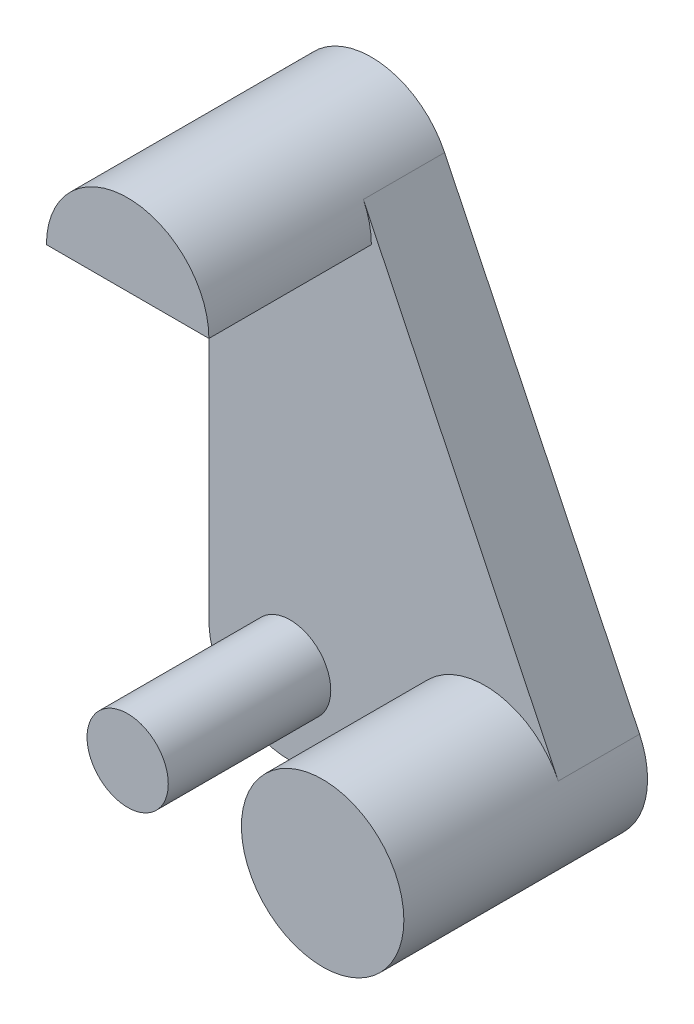
ISO-10303-21;
HEADER;
FILE_DESCRIPTION(('STEP AP214'),'2;1');
FILE_NAME('part.step','',(''),(''),'','','');
FILE_SCHEMA(('AUTOMOTIVE_DESIGN { 1 0 10303 214 1 1 1 1 }'));
ENDSEC;
DATA;
#1=APPLICATION_CONTEXT('core data for automotive mechanical design processes');
#2=APPLICATION_PROTOCOL_DEFINITION('international standard','automotive_design',2000,#1);
#3=PRODUCT_CONTEXT('',#1,'mechanical');
#4=PRODUCT('Part','Part','',(#3));
#5=PRODUCT_RELATED_PRODUCT_CATEGORY('part','',(#4));
#6=PRODUCT_DEFINITION_FORMATION('','',#4);
#7=PRODUCT_DEFINITION_CONTEXT('part definition',#1,'design');
#8=PRODUCT_DEFINITION('design','',#6,#7);
#9=PRODUCT_DEFINITION_SHAPE('','',#8);
#10=(LENGTH_UNIT() NAMED_UNIT(*) SI_UNIT(.MILLI.,.METRE.));
#11=(NAMED_UNIT(*) PLANE_ANGLE_UNIT() SI_UNIT($,.RADIAN.));
#12=(NAMED_UNIT(*) SI_UNIT($,.STERADIAN.) SOLID_ANGLE_UNIT());
#13=UNCERTAINTY_MEASURE_WITH_UNIT(LENGTH_MEASURE(1.E-05),#10,'distance_accuracy_value','');
#14=(GEOMETRIC_REPRESENTATION_CONTEXT(3) GLOBAL_UNCERTAINTY_ASSIGNED_CONTEXT((#13)) GLOBAL_UNIT_ASSIGNED_CONTEXT((#10,
#11,#12)) REPRESENTATION_CONTEXT('',''));
#15=CARTESIAN_POINT('',(0.,0.,0.));
#16=DIRECTION('',(0.,0.,1.));
#17=DIRECTION('',(1.,0.,0.));
#18=AXIS2_PLACEMENT_3D('',#15,#16,#17);
#19=CARTESIAN_POINT('',(0.,0.,5.));
#20=DIRECTION('',(0.,0.,1.));
#21=DIRECTION('',(1.,0.,0.));
#22=AXIS2_PLACEMENT_3D('',#19,#20,#21);
#23=PLANE('',#22);
#24=CARTESIAN_POINT('',(0.,0.,5.));
#25=DIRECTION('',(0.,0.,1.));
#26=DIRECTION('',(1.,0.,0.));
#27=AXIS2_PLACEMENT_3D('',#24,#25,#26);
#28=CIRCLE('',#27,2.5);
#29=CARTESIAN_POINT('',(2.5,0.,5.));
#30=VERTEX_POINT('',#29);
#31=EDGE_CURVE('E163',#30,#30,#28,.T.);
#32=ORIENTED_EDGE('',*,*,#31,.F.);
#33=EDGE_LOOP('',(#32));
#34=FACE_BOUND('',#33,.T.);
#35=DIRECTION('',(0.432731067584771,-0.901523057468274,0.));
#36=VECTOR('',#35,1.);
#37=CARTESIAN_POINT('',(14.2605411651047,6.84505975925025,5.));
#38=LINE('',#37,#36);
#39=CARTESIAN_POINT('',(4.50761528734137,27.1636553379239,5.));
#40=VERTEX_POINT('',#39);
#41=CARTESIAN_POINT('',(16.5076152873414,2.16365533792386,5.));
#42=VERTEX_POINT('',#41);
#43=EDGE_CURVE('E177',#40,#42,#38,.T.);
#44=ORIENTED_EDGE('',*,*,#43,.F.);
#45=CARTESIAN_POINT('',(0.,25.,5.));
#46=DIRECTION('',(0.,0.,1.));
#47=DIRECTION('',(1.,0.,0.));
#48=AXIS2_PLACEMENT_3D('',#45,#46,#47);
#49=CIRCLE('',#48,5.);
#50=CARTESIAN_POINT('',(5.,25.,5.));
#51=VERTEX_POINT('',#50);
#52=EDGE_CURVE('E57',#51,#40,#49,.T.);
#53=ORIENTED_EDGE('',*,*,#52,.F.);
#54=DIRECTION('',(1.,0.,0.));
#55=VECTOR('',#54,1.);
#56=CARTESIAN_POINT('',(-5.,25.,5.));
#57=LINE('',#56,#55);
#58=CARTESIAN_POINT('',(-4.99220280832975,25.,5.));
#59=VERTEX_POINT('',#58);
#60=EDGE_CURVE('E143',#59,#51,#57,.T.);
#61=ORIENTED_EDGE('',*,*,#60,.F.);
#62=DIRECTION('',(0.,-1.,0.));
#63=VECTOR('',#62,1.);
#64=CARTESIAN_POINT('',(-4.99220280832975,0.,5.));
#65=LINE('',#64,#63);
#66=CARTESIAN_POINT('',(-4.99220280832975,0.27912563569937,5.));
#67=VERTEX_POINT('',#66);
#68=EDGE_CURVE('E131',#59,#67,#65,.T.);
#69=ORIENTED_EDGE('',*,*,#68,.T.);
#70=CARTESIAN_POINT('',(0.,0.,5.));
#71=DIRECTION('',(0.,0.,1.));
#72=DIRECTION('',(1.,0.,0.));
#73=AXIS2_PLACEMENT_3D('',#70,#71,#72);
#74=CIRCLE('',#73,5.);
#75=CARTESIAN_POINT('',(0.,-5.,5.));
#76=VERTEX_POINT('',#75);
#77=EDGE_CURVE('E135',#76,#67,#74,.F.);
#78=ORIENTED_EDGE('',*,*,#77,.F.);
#79=DIRECTION('',(1.,0.,0.));
#80=VECTOR('',#79,1.);
#81=CARTESIAN_POINT('',(0.,-5.,5.));
#82=LINE('',#81,#80);
#83=CARTESIAN_POINT('',(12.,-5.,5.));
#84=VERTEX_POINT('',#83);
#85=EDGE_CURVE('E98',#76,#84,#82,.T.);
#86=ORIENTED_EDGE('',*,*,#85,.T.);
#87=CARTESIAN_POINT('',(12.,0.,5.));
#88=DIRECTION('',(0.,0.,1.));
#89=DIRECTION('',(1.,0.,0.));
#90=AXIS2_PLACEMENT_3D('',#87,#88,#89);
#91=CIRCLE('',#90,5.);
#92=EDGE_CURVE('E158',#42,#84,#91,.T.);
#93=ORIENTED_EDGE('',*,*,#92,.F.);
#94=EDGE_LOOP('',(#44,#53,#61,#69,#78,#86,#93));
#95=FACE_BOUND('',#94,.T.);
#96=ADVANCED_FACE('F41',(#34,#95),#23,.T.);
#97=CARTESIAN_POINT('',(0.,-5.,5.));
#98=DIRECTION('',(0.,1.,0.));
#99=DIRECTION('',(-1.,0.,0.));
#100=AXIS2_PLACEMENT_3D('',#97,#98,#99);
#101=PLANE('',#100);
#102=DIRECTION('',(1.,0.,0.));
#103=VECTOR('',#102,1.);
#104=CARTESIAN_POINT('',(0.,-5.,0.));
#105=LINE('',#104,#103);
#106=CARTESIAN_POINT('',(0.,-5.,0.));
#107=VERTEX_POINT('',#106);
#108=CARTESIAN_POINT('',(12.,-5.,0.));
#109=VERTEX_POINT('',#108);
#110=EDGE_CURVE('E171',#107,#109,#105,.T.);
#111=ORIENTED_EDGE('',*,*,#110,.T.);
#112=DIRECTION('',(0.,0.,-1.));
#113=VECTOR('',#112,1.);
#114=CARTESIAN_POINT('',(12.,-5.,5.));
#115=LINE('',#114,#113);
#116=EDGE_CURVE('E11',#84,#109,#115,.T.);
#117=ORIENTED_EDGE('',*,*,#116,.F.);
#118=ORIENTED_EDGE('',*,*,#85,.F.);
#119=DIRECTION('',(0.,0.,-1.));
#120=VECTOR('',#119,1.);
#121=CARTESIAN_POINT('',(0.,-5.,5.));
#122=LINE('',#121,#120);
#123=EDGE_CURVE('E66',#76,#107,#122,.T.);
#124=ORIENTED_EDGE('',*,*,#123,.T.);
#125=EDGE_LOOP('',(#111,#117,#118,#124));
#126=FACE_BOUND('',#125,.T.);
#127=ADVANCED_FACE('F43',(#126),#101,.F.);
#128=CARTESIAN_POINT('',(12.,0.,5.));
#129=DIRECTION('',(0.,0.,-1.));
#130=DIRECTION('',(-1.,0.,0.));
#131=AXIS2_PLACEMENT_3D('',#128,#129,#130);
#132=CYLINDRICAL_SURFACE('',#131,5.);
#133=CARTESIAN_POINT('',(12.,0.,0.));
#134=DIRECTION('',(0.,0.,1.));
#135=DIRECTION('',(1.,0.,0.));
#136=AXIS2_PLACEMENT_3D('',#133,#134,#135);
#137=CIRCLE('',#136,5.);
#138=CARTESIAN_POINT('',(16.5076152873414,2.16365533792386,0.));
#139=VERTEX_POINT('',#138);
#140=EDGE_CURVE('E186',#109,#139,#137,.T.);
#141=ORIENTED_EDGE('',*,*,#140,.T.);
#142=DIRECTION('',(0.,0.,-1.));
#143=VECTOR('',#142,1.);
#144=CARTESIAN_POINT('',(16.5076152873414,2.16365533792386,5.));
#145=LINE('',#144,#143);
#146=EDGE_CURVE('E50',#42,#139,#145,.T.);
#147=ORIENTED_EDGE('',*,*,#146,.F.);
#148=ORIENTED_EDGE('',*,*,#92,.T.);
#149=ORIENTED_EDGE('',*,*,#116,.T.);
#150=EDGE_LOOP('',(#141,#147,#148,#149));
#151=FACE_BOUND('',#150,.T.);
#152=CARTESIAN_POINT('',(12.,0.,15.));
#153=DIRECTION('',(0.,0.,1.));
#154=DIRECTION('',(1.,0.,0.));
#155=AXIS2_PLACEMENT_3D('',#152,#153,#154);
#156=CIRCLE('',#155,5.);
#157=CARTESIAN_POINT('',(17.,0.,15.));
#158=VERTEX_POINT('',#157);
#159=EDGE_CURVE('E159',#158,#158,#156,.T.);
#160=ORIENTED_EDGE('',*,*,#159,.F.);
#161=EDGE_LOOP('',(#160));
#162=FACE_BOUND('',#161,.T.);
#163=ADVANCED_FACE('F213',(#151,#162),#132,.T.);
#164=CARTESIAN_POINT('',(14.2605411651047,6.84505975925025,5.));
#165=DIRECTION('',(0.901523057468274,0.432731067584771,0.));
#166=DIRECTION('',(-0.432731067584771,0.901523057468274,0.));
#167=AXIS2_PLACEMENT_3D('',#164,#165,#166);
#168=PLANE('',#167);
#169=DIRECTION('',(0.432731067584771,-0.901523057468274,0.));
#170=VECTOR('',#169,1.);
#171=CARTESIAN_POINT('',(14.2605411651047,6.84505975925025,0.));
#172=LINE('',#171,#170);
#173=CARTESIAN_POINT('',(4.50761528734137,27.1636553379239,0.));
#174=VERTEX_POINT('',#173);
#175=EDGE_CURVE('E190',#174,#139,#172,.T.);
#176=ORIENTED_EDGE('',*,*,#175,.F.);
#177=DIRECTION('',(0.,0.,-1.));
#178=VECTOR('',#177,1.);
#179=CARTESIAN_POINT('',(4.50761528734137,27.1636553379239,5.));
#180=LINE('',#179,#178);
#181=EDGE_CURVE('E122',#40,#174,#180,.T.);
#182=ORIENTED_EDGE('',*,*,#181,.F.);
#183=ORIENTED_EDGE('',*,*,#43,.T.);
#184=ORIENTED_EDGE('',*,*,#146,.T.);
#185=EDGE_LOOP('',(#176,#182,#183,#184));
#186=FACE_BOUND('',#185,.T.);
#187=ADVANCED_FACE('F211',(#186),#168,.T.);
#188=CARTESIAN_POINT('',(0.,25.,5.));
#189=DIRECTION('',(0.,0.,-1.));
#190=DIRECTION('',(-1.,0.,0.));
#191=AXIS2_PLACEMENT_3D('',#188,#189,#190);
#192=CYLINDRICAL_SURFACE('',#191,5.);
#193=CARTESIAN_POINT('',(0.,25.,0.));
#194=DIRECTION('',(0.,0.,1.));
#195=DIRECTION('',(1.,0.,0.));
#196=AXIS2_PLACEMENT_3D('',#193,#194,#195);
#197=CIRCLE('',#196,5.);
#198=CARTESIAN_POINT('',(-4.99220280832975,25.2791256356994,0.));
#199=VERTEX_POINT('',#198);
#200=EDGE_CURVE('E117',#174,#199,#197,.T.);
#201=ORIENTED_EDGE('',*,*,#200,.T.);
#202=DIRECTION('',(0.,0.,-1.));
#203=VECTOR('',#202,1.);
#204=CARTESIAN_POINT('',(-4.99220280832975,25.2791256356994,5.));
#205=LINE('',#204,#203);
#206=CARTESIAN_POINT('',(-4.99220280832975,25.2791256356994,5.));
#207=VERTEX_POINT('',#206);
#208=EDGE_CURVE('E108',#207,#199,#205,.T.);
#209=ORIENTED_EDGE('',*,*,#208,.F.);
#210=CARTESIAN_POINT('',(-5.,25.,5.));
#211=VERTEX_POINT('',#210);
#212=EDGE_CURVE('E114',#207,#211,#49,.T.);
#213=ORIENTED_EDGE('',*,*,#212,.T.);
#214=DIRECTION('',(0.,0.,-1.));
#215=VECTOR('',#214,1.);
#216=CARTESIAN_POINT('',(-5.,25.,15.));
#217=LINE('',#216,#215);
#218=CARTESIAN_POINT('',(-5.,25.,15.));
#219=VERTEX_POINT('',#218);
#220=EDGE_CURVE('E155',#219,#211,#217,.T.);
#221=ORIENTED_EDGE('',*,*,#220,.F.);
#222=CARTESIAN_POINT('',(0.,25.,15.));
#223=DIRECTION('',(0.,0.,1.));
#224=DIRECTION('',(1.,0.,0.));
#225=AXIS2_PLACEMENT_3D('',#222,#223,#224);
#226=CIRCLE('',#225,5.);
#227=CARTESIAN_POINT('',(5.,25.,15.));
#228=VERTEX_POINT('',#227);
#229=EDGE_CURVE('E150',#228,#219,#226,.T.);
#230=ORIENTED_EDGE('',*,*,#229,.F.);
#231=DIRECTION('',(0.,0.,-1.));
#232=VECTOR('',#231,1.);
#233=CARTESIAN_POINT('',(5.,25.,15.));
#234=LINE('',#233,#232);
#235=EDGE_CURVE('E151',#228,#51,#234,.T.);
#236=ORIENTED_EDGE('',*,*,#235,.T.);
#237=ORIENTED_EDGE('',*,*,#52,.T.);
#238=ORIENTED_EDGE('',*,*,#181,.T.);
#239=EDGE_LOOP('',(#201,#209,#213,#221,#230,#236,#237,#238));
#240=FACE_BOUND('',#239,.T.);
#241=ADVANCED_FACE('F110',(#240),#192,.T.);
#242=CARTESIAN_POINT('',(-4.99220280832975,0.,5.));
#243=DIRECTION('',(1.,0.,0.));
#244=DIRECTION('',(0.,0.,-1.));
#245=AXIS2_PLACEMENT_3D('',#242,#243,#244);
#246=PLANE('',#245);
#247=DIRECTION('',(0.,-1.,0.));
#248=VECTOR('',#247,1.);
#249=CARTESIAN_POINT('',(-4.99220280832975,0.,0.));
#250=LINE('',#249,#248);
#251=CARTESIAN_POINT('',(-4.99220280832975,0.27912563569937,0.));
#252=VERTEX_POINT('',#251);
#253=EDGE_CURVE('E196',#199,#252,#250,.T.);
#254=ORIENTED_EDGE('',*,*,#253,.T.);
#255=DIRECTION('',(0.,0.,-1.));
#256=VECTOR('',#255,1.);
#257=CARTESIAN_POINT('',(-4.99220280832975,0.27912563569937,5.));
#258=LINE('',#257,#256);
#259=EDGE_CURVE('E123',#67,#252,#258,.T.);
#260=ORIENTED_EDGE('',*,*,#259,.F.);
#261=ORIENTED_EDGE('',*,*,#68,.F.);
#262=EDGE_CURVE('E127',#207,#59,#65,.T.);
#263=ORIENTED_EDGE('',*,*,#262,.F.);
#264=ORIENTED_EDGE('',*,*,#208,.T.);
#265=EDGE_LOOP('',(#254,#260,#261,#263,#264));
#266=FACE_BOUND('',#265,.T.);
#267=ADVANCED_FACE('F128',(#266),#246,.F.);
#268=CARTESIAN_POINT('',(0.,0.,5.));
#269=DIRECTION('',(0.,0.,-1.));
#270=DIRECTION('',(-1.,0.,0.));
#271=AXIS2_PLACEMENT_3D('',#268,#269,#270);
#272=CYLINDRICAL_SURFACE('',#271,5.);
#273=CARTESIAN_POINT('',(0.,0.,0.));
#274=DIRECTION('',(0.,0.,1.));
#275=DIRECTION('',(1.,0.,0.));
#276=AXIS2_PLACEMENT_3D('',#273,#274,#275);
#277=CIRCLE('',#276,5.);
#278=EDGE_CURVE('E178',#107,#252,#277,.F.);
#279=ORIENTED_EDGE('',*,*,#278,.F.);
#280=ORIENTED_EDGE('',*,*,#123,.F.);
#281=ORIENTED_EDGE('',*,*,#77,.T.);
#282=ORIENTED_EDGE('',*,*,#259,.T.);
#283=EDGE_LOOP('',(#279,#280,#281,#282));
#284=FACE_BOUND('',#283,.T.);
#285=ADVANCED_FACE('F217',(#284),#272,.T.);
#286=CARTESIAN_POINT('',(0.,0.,0.));
#287=DIRECTION('',(0.,0.,1.));
#288=DIRECTION('',(1.,0.,0.));
#289=AXIS2_PLACEMENT_3D('',#286,#287,#288);
#290=PLANE('',#289);
#291=ORIENTED_EDGE('',*,*,#110,.F.);
#292=ORIENTED_EDGE('',*,*,#278,.T.);
#293=ORIENTED_EDGE('',*,*,#253,.F.);
#294=ORIENTED_EDGE('',*,*,#200,.F.);
#295=ORIENTED_EDGE('',*,*,#175,.T.);
#296=ORIENTED_EDGE('',*,*,#140,.F.);
#297=EDGE_LOOP('',(#291,#292,#293,#294,#295,#296));
#298=FACE_BOUND('',#297,.T.);
#299=ADVANCED_FACE('F216',(#298),#290,.F.);
#300=CARTESIAN_POINT('',(0.,0.,15.));
#301=DIRECTION('',(0.,0.,-1.));
#302=DIRECTION('',(-1.,0.,0.));
#303=AXIS2_PLACEMENT_3D('',#300,#301,#302);
#304=CYLINDRICAL_SURFACE('',#303,2.5);
#305=CARTESIAN_POINT('',(0.,0.,15.));
#306=DIRECTION('',(0.,0.,1.));
#307=DIRECTION('',(1.,0.,0.));
#308=AXIS2_PLACEMENT_3D('',#305,#306,#307);
#309=CIRCLE('',#308,2.5);
#310=CARTESIAN_POINT('',(2.5,0.,15.));
#311=VERTEX_POINT('',#310);
#312=EDGE_CURVE('E167',#311,#311,#309,.T.);
#313=ORIENTED_EDGE('',*,*,#312,.F.);
#314=EDGE_LOOP('',(#313));
#315=FACE_BOUND('',#314,.T.);
#316=ORIENTED_EDGE('',*,*,#31,.T.);
#317=EDGE_LOOP('',(#316));
#318=FACE_BOUND('',#317,.T.);
#319=ADVANCED_FACE('F252',(#315,#318),#304,.T.);
#320=CARTESIAN_POINT('',(0.,0.,15.));
#321=DIRECTION('',(0.,0.,1.));
#322=DIRECTION('',(1.,0.,0.));
#323=AXIS2_PLACEMENT_3D('',#320,#321,#322);
#324=PLANE('',#323);
#325=ORIENTED_EDGE('',*,*,#312,.T.);
#326=EDGE_LOOP('',(#325));
#327=FACE_BOUND('',#326,.T.);
#328=ADVANCED_FACE('F294',(#327),#324,.T.);
#329=CARTESIAN_POINT('',(12.,0.,15.));
#330=DIRECTION('',(0.,0.,1.));
#331=DIRECTION('',(1.,0.,0.));
#332=AXIS2_PLACEMENT_3D('',#329,#330,#331);
#333=PLANE('',#332);
#334=ORIENTED_EDGE('',*,*,#159,.T.);
#335=EDGE_LOOP('',(#334));
#336=FACE_BOUND('',#335,.T.);
#337=ADVANCED_FACE('F301',(#336),#333,.T.);
#338=CARTESIAN_POINT('',(0.,25.,5.));
#339=DIRECTION('',(0.,0.,1.));
#340=DIRECTION('',(1.,0.,0.));
#341=AXIS2_PLACEMENT_3D('',#338,#339,#340);
#342=PLANE('',#341);
#343=ORIENTED_EDGE('',*,*,#212,.F.);
#344=ORIENTED_EDGE('',*,*,#262,.T.);
#345=EDGE_CURVE('E138',#211,#59,#57,.T.);
#346=ORIENTED_EDGE('',*,*,#345,.F.);
#347=EDGE_LOOP('',(#343,#344,#346));
#348=FACE_BOUND('',#347,.T.);
#349=ADVANCED_FACE('F137',(#348),#342,.F.);
#350=CARTESIAN_POINT('',(-5.,25.,15.));
#351=DIRECTION('',(0.,1.,0.));
#352=DIRECTION('',(0.,0.,1.));
#353=AXIS2_PLACEMENT_3D('',#350,#351,#352);
#354=PLANE('',#353);
#355=ORIENTED_EDGE('',*,*,#345,.T.);
#356=ORIENTED_EDGE('',*,*,#60,.T.);
#357=ORIENTED_EDGE('',*,*,#235,.F.);
#358=DIRECTION('',(1.,0.,0.));
#359=VECTOR('',#358,1.);
#360=CARTESIAN_POINT('',(-5.,25.,15.));
#361=LINE('',#360,#359);
#362=EDGE_CURVE('E146',#219,#228,#361,.T.);
#363=ORIENTED_EDGE('',*,*,#362,.F.);
#364=ORIENTED_EDGE('',*,*,#220,.T.);
#365=EDGE_LOOP('',(#355,#356,#357,#363,#364));
#366=FACE_BOUND('',#365,.T.);
#367=ADVANCED_FACE('F226',(#366),#354,.F.);
#368=CARTESIAN_POINT('',(0.,25.,15.));
#369=DIRECTION('',(0.,0.,1.));
#370=DIRECTION('',(1.,0.,0.));
#371=AXIS2_PLACEMENT_3D('',#368,#369,#370);
#372=PLANE('',#371);
#373=ORIENTED_EDGE('',*,*,#229,.T.);
#374=ORIENTED_EDGE('',*,*,#362,.T.);
#375=EDGE_LOOP('',(#373,#374));
#376=FACE_BOUND('',#375,.T.);
#377=ADVANCED_FACE('F233',(#376),#372,.T.);
#378=CLOSED_SHELL('',(#96,#127,#163,#187,#241,#267,#285,#299,#319,#328,#337,#349,#367,#377));
#379=MANIFOLD_SOLID_BREP('B2',#378);
#380=ADVANCED_BREP_SHAPE_REPRESENTATION('',(#18,#379),#14);
#381=SHAPE_DEFINITION_REPRESENTATION(#9,#380);
ENDSEC;
END-ISO-10303-21;
